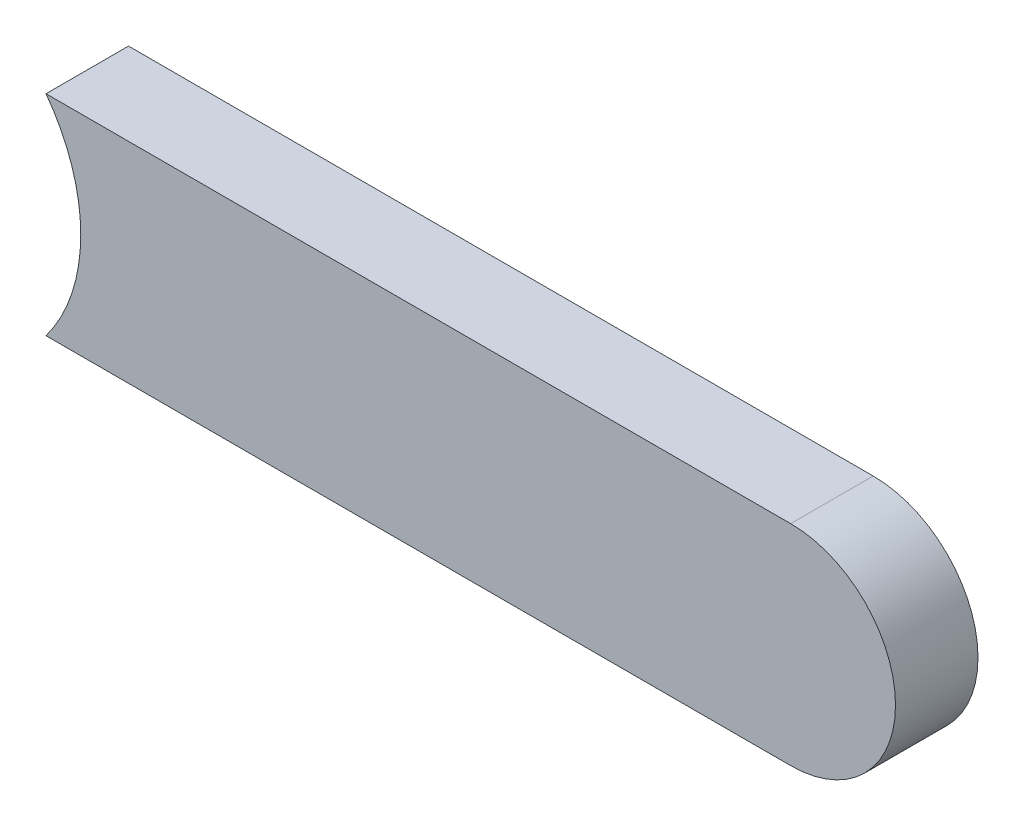
ISO-10303-21;
HEADER;
FILE_DESCRIPTION(('STEP AP214'),'2;1');
FILE_NAME('part.step','',(''),(''),'','','');
FILE_SCHEMA(('AUTOMOTIVE_DESIGN { 1 0 10303 214 1 1 1 1 }'));
ENDSEC;
DATA;
#1=APPLICATION_CONTEXT('core data for automotive mechanical design processes');
#2=APPLICATION_PROTOCOL_DEFINITION('international standard','automotive_design',2000,#1);
#3=PRODUCT_CONTEXT('',#1,'mechanical');
#4=PRODUCT('Part','Part','',(#3));
#5=PRODUCT_RELATED_PRODUCT_CATEGORY('part','',(#4));
#6=PRODUCT_DEFINITION_FORMATION('','',#4);
#7=PRODUCT_DEFINITION_CONTEXT('part definition',#1,'design');
#8=PRODUCT_DEFINITION('design','',#6,#7);
#9=PRODUCT_DEFINITION_SHAPE('','',#8);
#10=(LENGTH_UNIT() NAMED_UNIT(*) SI_UNIT(.MILLI.,.METRE.));
#11=(NAMED_UNIT(*) PLANE_ANGLE_UNIT() SI_UNIT($,.RADIAN.));
#12=(NAMED_UNIT(*) SI_UNIT($,.STERADIAN.) SOLID_ANGLE_UNIT());
#13=UNCERTAINTY_MEASURE_WITH_UNIT(LENGTH_MEASURE(1.E-05),#10,'distance_accuracy_value','');
#14=(GEOMETRIC_REPRESENTATION_CONTEXT(3) GLOBAL_UNCERTAINTY_ASSIGNED_CONTEXT((#13)) GLOBAL_UNIT_ASSIGNED_CONTEXT((#10,
#11,#12)) REPRESENTATION_CONTEXT('',''));
#15=CARTESIAN_POINT('',(0.,0.,0.));
#16=DIRECTION('',(0.,0.,1.));
#17=DIRECTION('',(1.,0.,0.));
#18=AXIS2_PLACEMENT_3D('',#15,#16,#17);
#19=CARTESIAN_POINT('',(140.040748231104,61.390784,0.));
#20=DIRECTION('',(0.,1.,0.));
#21=DIRECTION('',(1.,0.,0.));
#22=AXIS2_PLACEMENT_3D('',#19,#20,#21);
#23=PLANE('',#22);
#24=DIRECTION('',(1.,0.,0.));
#25=VECTOR('',#24,1.);
#26=CARTESIAN_POINT('',(139.7,61.390784,0.1999996));
#27=LINE('',#26,#25);
#28=CARTESIAN_POINT('',(140.040748231104,61.390784,0.1999996));
#29=VERTEX_POINT('',#28);
#30=CARTESIAN_POINT('',(141.8457412,61.390784,0.1999996));
#31=VERTEX_POINT('',#30);
#32=EDGE_CURVE('E11',#29,#31,#27,.T.);
#33=ORIENTED_EDGE('',*,*,#32,.F.);
#34=DIRECTION('',(0.,0.,1.));
#35=VECTOR('',#34,1.);
#36=CARTESIAN_POINT('',(140.040748231104,61.390784,0.));
#37=LINE('',#36,#35);
#38=CARTESIAN_POINT('',(140.040748231104,61.390784,0.));
#39=VERTEX_POINT('',#38);
#40=EDGE_CURVE('E24',#39,#29,#37,.T.);
#41=ORIENTED_EDGE('',*,*,#40,.F.);
#42=DIRECTION('',(1.,0.,0.));
#43=VECTOR('',#42,1.);
#44=CARTESIAN_POINT('',(139.7,61.390784,0.));
#45=LINE('',#44,#43);
#46=CARTESIAN_POINT('',(141.8457412,61.390784,0.));
#47=VERTEX_POINT('',#46);
#48=EDGE_CURVE('E82',#39,#47,#45,.T.);
#49=ORIENTED_EDGE('',*,*,#48,.T.);
#50=DIRECTION('',(0.,0.,1.));
#51=VECTOR('',#50,1.);
#52=CARTESIAN_POINT('',(141.8457412,61.390784,0.));
#53=LINE('',#52,#51);
#54=EDGE_CURVE('E37',#47,#31,#53,.T.);
#55=ORIENTED_EDGE('',*,*,#54,.T.);
#56=EDGE_LOOP('',(#33,#41,#49,#55));
#57=FACE_BOUND('',#56,.T.);
#58=ADVANCED_FACE('F17',(#57),#23,.F.);
#59=CARTESIAN_POINT('',(141.8457412,61.644784,0.));
#60=DIRECTION('',(0.,0.,-1.));
#61=DIRECTION('',(-1.11896493820492E-13,-1.,0.));
#62=AXIS2_PLACEMENT_3D('',#59,#60,#61);
#63=CYLINDRICAL_SURFACE('',#62,0.253999999999998);
#64=CARTESIAN_POINT('',(141.8457412,61.644784,0.1999996));
#65=DIRECTION('',(0.,0.,1.));
#66=DIRECTION('',(-1.11896493820492E-13,-1.,0.));
#67=AXIS2_PLACEMENT_3D('',#64,#65,#66);
#68=CIRCLE('',#67,0.253999999999998);
#69=CARTESIAN_POINT('',(141.8457412,61.898784,0.1999996));
#70=VERTEX_POINT('',#69);
#71=EDGE_CURVE('E97',#31,#70,#68,.T.);
#72=ORIENTED_EDGE('',*,*,#71,.F.);
#73=ORIENTED_EDGE('',*,*,#54,.F.);
#74=CARTESIAN_POINT('',(141.8457412,61.644784,0.));
#75=DIRECTION('',(0.,0.,1.));
#76=DIRECTION('',(-1.11896493820492E-13,-1.,0.));
#77=AXIS2_PLACEMENT_3D('',#74,#75,#76);
#78=CIRCLE('',#77,0.253999999999998);
#79=CARTESIAN_POINT('',(141.8457412,61.898784,0.));
#80=VERTEX_POINT('',#79);
#81=EDGE_CURVE('E94',#47,#80,#78,.T.);
#82=ORIENTED_EDGE('',*,*,#81,.T.);
#83=DIRECTION('',(0.,0.,1.));
#84=VECTOR('',#83,1.);
#85=CARTESIAN_POINT('',(141.8457412,61.898784,0.));
#86=LINE('',#85,#84);
#87=EDGE_CURVE('E92',#80,#70,#86,.T.);
#88=ORIENTED_EDGE('',*,*,#87,.T.);
#89=EDGE_LOOP('',(#72,#73,#82,#88));
#90=FACE_BOUND('',#89,.T.);
#91=ADVANCED_FACE('F103',(#90),#63,.T.);
#92=CARTESIAN_POINT('',(141.8457412,61.898784,0.));
#93=DIRECTION('',(0.,-1.,0.));
#94=DIRECTION('',(-1.,0.,0.));
#95=AXIS2_PLACEMENT_3D('',#92,#93,#94);
#96=PLANE('',#95);
#97=DIRECTION('',(-1.,0.,0.));
#98=VECTOR('',#97,1.);
#99=CARTESIAN_POINT('',(141.8457412,61.898784,0.1999996));
#100=LINE('',#99,#98);
#101=CARTESIAN_POINT('',(140.040748231104,61.898784,0.1999996));
#102=VERTEX_POINT('',#101);
#103=EDGE_CURVE('E89',#70,#102,#100,.T.);
#104=ORIENTED_EDGE('',*,*,#103,.F.);
#105=ORIENTED_EDGE('',*,*,#87,.F.);
#106=DIRECTION('',(-1.,0.,0.));
#107=VECTOR('',#106,1.);
#108=CARTESIAN_POINT('',(141.8457412,61.898784,0.));
#109=LINE('',#108,#107);
#110=CARTESIAN_POINT('',(140.040748231104,61.898784,0.));
#111=VERTEX_POINT('',#110);
#112=EDGE_CURVE('E87',#80,#111,#109,.T.);
#113=ORIENTED_EDGE('',*,*,#112,.T.);
#114=DIRECTION('',(0.,0.,1.));
#115=VECTOR('',#114,1.);
#116=CARTESIAN_POINT('',(140.040748231104,61.898784,0.));
#117=LINE('',#116,#115);
#118=EDGE_CURVE('E69',#111,#102,#117,.T.);
#119=ORIENTED_EDGE('',*,*,#118,.T.);
#120=EDGE_LOOP('',(#104,#105,#113,#119));
#121=FACE_BOUND('',#120,.T.);
#122=ADVANCED_FACE('F108',(#121),#96,.F.);
#123=CARTESIAN_POINT('',(139.7,61.644784,0.));
#124=DIRECTION('',(0.,0.,-1.));
#125=DIRECTION('',(1.,0.,0.));
#126=AXIS2_PLACEMENT_3D('',#123,#124,#125);
#127=CYLINDRICAL_SURFACE('',#126,0.42500042);
#128=DIRECTION('',(0.,0.,1.));
#129=VECTOR('',#128,1.);
#130=CARTESIAN_POINT('',(140.12500042,61.644784,0.));
#131=LINE('',#130,#129);
#132=CARTESIAN_POINT('',(140.12500042,61.644784,0.));
#133=VERTEX_POINT('',#132);
#134=CARTESIAN_POINT('',(140.12500042,61.644784,0.1999996));
#135=VERTEX_POINT('',#134);
#136=EDGE_CURVE('E59',#133,#135,#131,.T.);
#137=ORIENTED_EDGE('',*,*,#136,.T.);
#138=CARTESIAN_POINT('',(139.7,61.644784,0.1999996));
#139=DIRECTION('',(0.,0.,1.));
#140=DIRECTION('',(1.,0.,0.));
#141=AXIS2_PLACEMENT_3D('',#138,#139,#140);
#142=CIRCLE('',#141,0.42500042);
#143=EDGE_CURVE('E70',#135,#102,#142,.T.);
#144=ORIENTED_EDGE('',*,*,#143,.T.);
#145=ORIENTED_EDGE('',*,*,#118,.F.);
#146=CARTESIAN_POINT('',(139.7,61.644784,0.));
#147=DIRECTION('',(0.,0.,1.));
#148=DIRECTION('',(1.,0.,0.));
#149=AXIS2_PLACEMENT_3D('',#146,#147,#148);
#150=CIRCLE('',#149,0.42500042);
#151=EDGE_CURVE('E73',#133,#111,#150,.T.);
#152=ORIENTED_EDGE('',*,*,#151,.F.);
#153=EDGE_LOOP('',(#137,#144,#145,#152));
#154=FACE_BOUND('',#153,.T.);
#155=ADVANCED_FACE('F74',(#154),#127,.F.);
#156=CARTESIAN_POINT('',(139.7,61.644784,0.));
#157=DIRECTION('',(0.,0.,-1.));
#158=DIRECTION('',(1.,0.,0.));
#159=AXIS2_PLACEMENT_3D('',#156,#157,#158);
#160=CYLINDRICAL_SURFACE('',#159,0.42500042);
#161=ORIENTED_EDGE('',*,*,#40,.T.);
#162=CARTESIAN_POINT('',(139.7,61.644784,0.1999996));
#163=DIRECTION('',(0.,0.,1.));
#164=DIRECTION('',(1.,0.,0.));
#165=AXIS2_PLACEMENT_3D('',#162,#163,#164);
#166=CIRCLE('',#165,0.42500042);
#167=EDGE_CURVE('E65',#29,#135,#166,.T.);
#168=ORIENTED_EDGE('',*,*,#167,.T.);
#169=ORIENTED_EDGE('',*,*,#136,.F.);
#170=EDGE_CURVE('E63',#39,#133,#150,.T.);
#171=ORIENTED_EDGE('',*,*,#170,.F.);
#172=EDGE_LOOP('',(#161,#168,#169,#171));
#173=FACE_BOUND('',#172,.T.);
#174=ADVANCED_FACE('F61',(#173),#160,.F.);
#175=CARTESIAN_POINT('',(139.7,61.390784,0.));
#176=DIRECTION('',(0.,0.,-1.));
#177=DIRECTION('',(-1.,0.,0.));
#178=AXIS2_PLACEMENT_3D('',#175,#176,#177);
#179=PLANE('',#178);
#180=ORIENTED_EDGE('',*,*,#48,.F.);
#181=ORIENTED_EDGE('',*,*,#170,.T.);
#182=ORIENTED_EDGE('',*,*,#151,.T.);
#183=ORIENTED_EDGE('',*,*,#112,.F.);
#184=ORIENTED_EDGE('',*,*,#81,.F.);
#185=EDGE_LOOP('',(#180,#181,#182,#183,#184));
#186=FACE_BOUND('',#185,.T.);
#187=ADVANCED_FACE('F80',(#186),#179,.T.);
#188=CARTESIAN_POINT('',(139.7,61.390784,0.1999996));
#189=DIRECTION('',(0.,0.,-1.));
#190=DIRECTION('',(-1.,0.,0.));
#191=AXIS2_PLACEMENT_3D('',#188,#189,#190);
#192=PLANE('',#191);
#193=ORIENTED_EDGE('',*,*,#167,.F.);
#194=ORIENTED_EDGE('',*,*,#32,.T.);
#195=ORIENTED_EDGE('',*,*,#71,.T.);
#196=ORIENTED_EDGE('',*,*,#103,.T.);
#197=ORIENTED_EDGE('',*,*,#143,.F.);
#198=EDGE_LOOP('',(#193,#194,#195,#196,#197));
#199=FACE_BOUND('',#198,.T.);
#200=ADVANCED_FACE('F106',(#199),#192,.F.);
#201=CLOSED_SHELL('',(#58,#91,#122,#155,#174,#187,#200));
#202=MANIFOLD_SOLID_BREP('B1',#201);
#203=ADVANCED_BREP_SHAPE_REPRESENTATION('',(#18,#202),#14);
#204=SHAPE_DEFINITION_REPRESENTATION(#9,#203);
ENDSEC;
END-ISO-10303-21;
